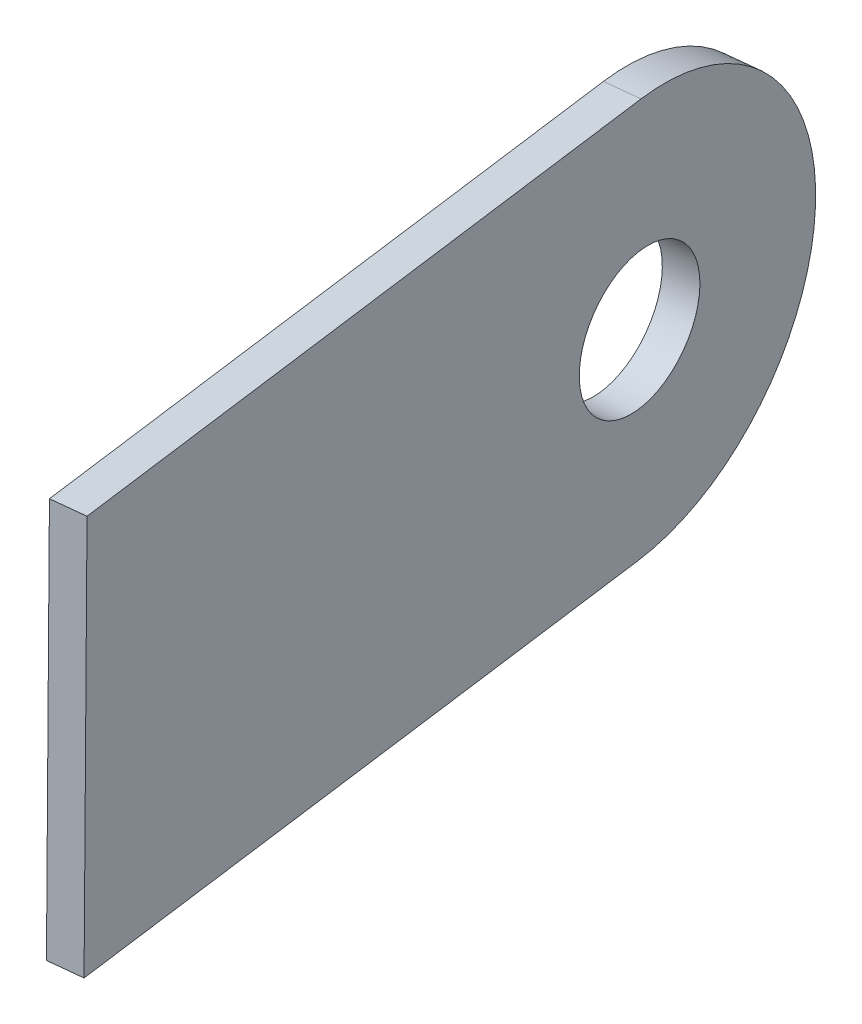
ISO-10303-21;
HEADER;
FILE_DESCRIPTION(('STEP AP214'),'2;1');
FILE_NAME('part.step','',(''),(''),'','','');
FILE_SCHEMA(('AUTOMOTIVE_DESIGN { 1 0 10303 214 1 1 1 1 }'));
ENDSEC;
DATA;
#1=APPLICATION_CONTEXT('core data for automotive mechanical design processes');
#2=APPLICATION_PROTOCOL_DEFINITION('international standard','automotive_design',2000,#1);
#3=PRODUCT_CONTEXT('',#1,'mechanical');
#4=PRODUCT('Part','Part','',(#3));
#5=PRODUCT_RELATED_PRODUCT_CATEGORY('part','',(#4));
#6=PRODUCT_DEFINITION_FORMATION('','',#4);
#7=PRODUCT_DEFINITION_CONTEXT('part definition',#1,'design');
#8=PRODUCT_DEFINITION('design','',#6,#7);
#9=PRODUCT_DEFINITION_SHAPE('','',#8);
#10=(LENGTH_UNIT() NAMED_UNIT(*) SI_UNIT(.MILLI.,.METRE.));
#11=(NAMED_UNIT(*) PLANE_ANGLE_UNIT() SI_UNIT($,.RADIAN.));
#12=(NAMED_UNIT(*) SI_UNIT($,.STERADIAN.) SOLID_ANGLE_UNIT());
#13=UNCERTAINTY_MEASURE_WITH_UNIT(LENGTH_MEASURE(1.E-05),#10,'distance_accuracy_value','');
#14=(GEOMETRIC_REPRESENTATION_CONTEXT(3) GLOBAL_UNCERTAINTY_ASSIGNED_CONTEXT((#13)) GLOBAL_UNIT_ASSIGNED_CONTEXT((#10,
#11,#12)) REPRESENTATION_CONTEXT('',''));
#15=CARTESIAN_POINT('',(0.,0.,0.));
#16=DIRECTION('',(0.,0.,1.));
#17=DIRECTION('',(1.,0.,0.));
#18=AXIS2_PLACEMENT_3D('',#15,#16,#17);
#19=CARTESIAN_POINT('',(310.062541986796,135.096645992842,-551.594597532469));
#20=DIRECTION('',(-0.992348265819815,0.0144812145690195,0.122618162394535));
#21=DIRECTION('',(0.122631021273154,0.,0.992452332669687));
#22=AXIS2_PLACEMENT_3D('',#19,#20,#21);
#23=PLANE('',#22);
#24=DIRECTION('',(-0.0156095263850589,-0.999844159646676,-0.00824615707260503));
#25=VECTOR('',#24,1.);
#26=CARTESIAN_POINT('',(313.584820993087,125.270500956842,-521.928340044654));
#27=LINE('',#26,#25);
#28=CARTESIAN_POINT('',(313.882182470723,144.317532198112,-521.771250752421));
#29=VERTEX_POINT('',#28);
#30=CARTESIAN_POINT('',(313.584820993087,125.270500956842,-521.928340044654));
#31=VERTEX_POINT('',#30);
#32=EDGE_CURVE('E91',#29,#31,#27,.T.);
#33=ORIENTED_EDGE('',*,*,#32,.T.);
#34=DIRECTION('',(-0.122479639166846,0.0100970711118635,-0.992419662816352));
#35=VECTOR('',#34,1.);
#36=CARTESIAN_POINT('',(309.913861247979,125.573130372207,-551.673142178586));
#37=LINE('',#36,#35);
#38=CARTESIAN_POINT('',(309.913861247979,125.573130372207,-551.673142178586));
#39=VERTEX_POINT('',#38);
#40=EDGE_CURVE('E86',#31,#39,#37,.T.);
#41=ORIENTED_EDGE('',*,*,#40,.T.);
#42=CARTESIAN_POINT('',(310.062541986796,135.096645992842,-551.594597532469));
#43=DIRECTION('',(0.992348265819815,-0.0144812145690195,-0.122618162394535));
#44=DIRECTION('',(0.122631021273154,0.,0.992452332669687));
#45=AXIS2_PLACEMENT_3D('',#42,#43,#44);
#46=CIRCLE('',#45,9.52500000000001);
#47=CARTESIAN_POINT('',(310.211222725614,144.620161613476,-551.516052886353));
#48=VERTEX_POINT('',#47);
#49=EDGE_CURVE('E89',#39,#48,#46,.T.);
#50=ORIENTED_EDGE('',*,*,#49,.T.);
#51=DIRECTION('',(0.122479639166846,-0.0100970711118644,0.992419662816352));
#52=VECTOR('',#51,1.);
#53=CARTESIAN_POINT('',(313.882182470723,144.317532198112,-521.771250752421));
#54=LINE('',#53,#52);
#55=EDGE_CURVE('E56',#48,#29,#54,.T.);
#56=ORIENTED_EDGE('',*,*,#55,.T.);
#57=EDGE_LOOP('',(#33,#41,#50,#56));
#58=FACE_BOUND('',#57,.T.);
#59=CARTESIAN_POINT('',(310.062541986796,135.096645992842,-551.594597532469));
#60=DIRECTION('',(0.992348265819815,-0.0144812145690195,-0.122618162394535));
#61=DIRECTION('',(-0.122631021273154,0.,-0.992452332669687));
#62=AXIS2_PLACEMENT_3D('',#59,#60,#61);
#63=CIRCLE('',#62,3.2639);
#64=CARTESIAN_POINT('',(309.662286596463,135.096645992842,-554.83386270107));
#65=VERTEX_POINT('',#64);
#66=EDGE_CURVE('E106',#65,#65,#63,.T.);
#67=ORIENTED_EDGE('',*,*,#66,.F.);
#68=EDGE_LOOP('',(#67));
#69=FACE_BOUND('',#68,.T.);
#70=ADVANCED_FACE('F39',(#58,#69),#23,.F.);
#71=CARTESIAN_POINT('',(308.487189114808,135.11963492097,-551.399941199668));
#72=DIRECTION('',(-0.992348265819815,0.0144812145690195,0.122618162394535));
#73=DIRECTION('',(0.122631021273154,0.,0.992452332669687));
#74=AXIS2_PLACEMENT_3D('',#71,#72,#73);
#75=PLANE('',#74);
#76=DIRECTION('',(-0.0156095263850589,-0.999844159646676,-0.00824615707260503));
#77=VECTOR('',#76,1.);
#78=CARTESIAN_POINT('',(312.009468121099,125.293489884971,-521.733683711853));
#79=LINE('',#78,#77);
#80=CARTESIAN_POINT('',(312.306829598734,144.34052112624,-521.57659441962));
#81=VERTEX_POINT('',#80);
#82=CARTESIAN_POINT('',(312.009468121099,125.293489884971,-521.733683711853));
#83=VERTEX_POINT('',#82);
#84=EDGE_CURVE('E103',#81,#83,#79,.T.);
#85=ORIENTED_EDGE('',*,*,#84,.F.);
#86=DIRECTION('',(0.122479639166846,-0.0100970711118644,0.992419662816352));
#87=VECTOR('',#86,1.);
#88=CARTESIAN_POINT('',(312.306829598734,144.34052112624,-521.57659441962));
#89=LINE('',#88,#87);
#90=CARTESIAN_POINT('',(308.635869853625,144.643150541605,-551.321396553551));
#91=VERTEX_POINT('',#90);
#92=EDGE_CURVE('E79',#91,#81,#89,.T.);
#93=ORIENTED_EDGE('',*,*,#92,.F.);
#94=CARTESIAN_POINT('',(308.487189114808,135.11963492097,-551.399941199668));
#95=DIRECTION('',(0.992348265819815,-0.0144812145690195,-0.122618162394535));
#96=DIRECTION('',(0.122631021273154,0.,0.992452332669687));
#97=AXIS2_PLACEMENT_3D('',#94,#95,#96);
#98=CIRCLE('',#97,9.52500000000001);
#99=CARTESIAN_POINT('',(308.33850837599,125.596119300336,-551.478485845784));
#100=VERTEX_POINT('',#99);
#101=EDGE_CURVE('E73',#100,#91,#98,.T.);
#102=ORIENTED_EDGE('',*,*,#101,.F.);
#103=DIRECTION('',(-0.122479639166846,0.0100970711118635,-0.992419662816352));
#104=VECTOR('',#103,1.);
#105=CARTESIAN_POINT('',(308.33850837599,125.596119300336,-551.478485845784));
#106=LINE('',#105,#104);
#107=EDGE_CURVE('E95',#83,#100,#106,.T.);
#108=ORIENTED_EDGE('',*,*,#107,.F.);
#109=EDGE_LOOP('',(#85,#93,#102,#108));
#110=FACE_BOUND('',#109,.T.);
#111=CARTESIAN_POINT('',(308.487189114808,135.11963492097,-551.399941199668));
#112=DIRECTION('',(0.992348265819815,-0.0144812145690195,-0.122618162394535));
#113=DIRECTION('',(-0.122631021273154,0.,-0.992452332669687));
#114=AXIS2_PLACEMENT_3D('',#111,#112,#113);
#115=CIRCLE('',#114,3.2639);
#116=CARTESIAN_POINT('',(308.086933724474,135.11963492097,-554.639206368268));
#117=VERTEX_POINT('',#116);
#118=EDGE_CURVE('E118',#117,#117,#115,.T.);
#119=ORIENTED_EDGE('',*,*,#118,.T.);
#120=EDGE_LOOP('',(#119));
#121=FACE_BOUND('',#120,.T.);
#122=ADVANCED_FACE('F114',(#110,#121),#75,.T.);
#123=CARTESIAN_POINT('',(313.584820993087,125.270500956842,-521.928340044654));
#124=DIRECTION('',(-0.122479639166846,0.0100970711118623,-0.992419662816352));
#125=DIRECTION('',(-0.992470255696503,0.,0.122485883095637));
#126=AXIS2_PLACEMENT_3D('',#123,#124,#125);
#127=PLANE('',#126);
#128=ORIENTED_EDGE('',*,*,#84,.T.);
#129=DIRECTION('',(-0.992348265819815,0.0144812145690195,0.122618162394535));
#130=VECTOR('',#129,1.);
#131=CARTESIAN_POINT('',(313.584820993087,125.270500956842,-521.928340044654));
#132=LINE('',#131,#130);
#133=EDGE_CURVE('E11',#31,#83,#132,.T.);
#134=ORIENTED_EDGE('',*,*,#133,.F.);
#135=ORIENTED_EDGE('',*,*,#32,.F.);
#136=DIRECTION('',(-0.992348265819815,0.0144812145690195,0.122618162394535));
#137=VECTOR('',#136,1.);
#138=CARTESIAN_POINT('',(313.882182470723,144.317532198112,-521.771250752421));
#139=LINE('',#138,#137);
#140=EDGE_CURVE('E99',#29,#81,#139,.T.);
#141=ORIENTED_EDGE('',*,*,#140,.T.);
#142=EDGE_LOOP('',(#128,#134,#135,#141));
#143=FACE_BOUND('',#142,.T.);
#144=ADVANCED_FACE('F41',(#143),#127,.F.);
#145=CARTESIAN_POINT('',(309.913861247979,125.573130372207,-551.673142178586));
#146=DIRECTION('',(0.0156095263850613,0.999844159646676,0.00824615707260589));
#147=DIRECTION('',(-0.999878155635189,0.0156100571290523,0.));
#148=AXIS2_PLACEMENT_3D('',#145,#146,#147);
#149=PLANE('',#148);
#150=ORIENTED_EDGE('',*,*,#107,.T.);
#151=DIRECTION('',(-0.992348265819815,0.0144812145690195,0.122618162394535));
#152=VECTOR('',#151,1.);
#153=CARTESIAN_POINT('',(309.913861247979,125.573130372207,-551.673142178586));
#154=LINE('',#153,#152);
#155=EDGE_CURVE('E48',#39,#100,#154,.T.);
#156=ORIENTED_EDGE('',*,*,#155,.F.);
#157=ORIENTED_EDGE('',*,*,#40,.F.);
#158=ORIENTED_EDGE('',*,*,#133,.T.);
#159=EDGE_LOOP('',(#150,#156,#157,#158));
#160=FACE_BOUND('',#159,.T.);
#161=ADVANCED_FACE('F94',(#160),#149,.F.);
#162=CARTESIAN_POINT('',(310.062541986796,135.096645992842,-551.594597532469));
#163=DIRECTION('',(-0.992348265819815,0.0144812145690195,0.122618162394535));
#164=DIRECTION('',(0.122631021273154,0.,0.992452332669687));
#165=AXIS2_PLACEMENT_3D('',#162,#163,#164);
#166=CYLINDRICAL_SURFACE('',#165,9.52500000000001);
#167=ORIENTED_EDGE('',*,*,#101,.T.);
#168=DIRECTION('',(-0.992348265819815,0.0144812145690195,0.122618162394535));
#169=VECTOR('',#168,1.);
#170=CARTESIAN_POINT('',(310.211222725614,144.620161613476,-551.516052886353));
#171=LINE('',#170,#169);
#172=EDGE_CURVE('E96',#48,#91,#171,.T.);
#173=ORIENTED_EDGE('',*,*,#172,.F.);
#174=ORIENTED_EDGE('',*,*,#49,.F.);
#175=ORIENTED_EDGE('',*,*,#155,.T.);
#176=EDGE_LOOP('',(#167,#173,#174,#175));
#177=FACE_BOUND('',#176,.T.);
#178=ADVANCED_FACE('F97',(#177),#166,.T.);
#179=CARTESIAN_POINT('',(313.882182470723,144.317532198112,-521.771250752421));
#180=DIRECTION('',(-0.0156095263850614,-0.999844159646676,-0.00824615707260681));
#181=DIRECTION('',(0.999878155635189,-0.0156100571290524,0.));
#182=AXIS2_PLACEMENT_3D('',#179,#180,#181);
#183=PLANE('',#182);
#184=ORIENTED_EDGE('',*,*,#92,.T.);
#185=ORIENTED_EDGE('',*,*,#140,.F.);
#186=ORIENTED_EDGE('',*,*,#55,.F.);
#187=ORIENTED_EDGE('',*,*,#172,.T.);
#188=EDGE_LOOP('',(#184,#185,#186,#187));
#189=FACE_BOUND('',#188,.T.);
#190=ADVANCED_FACE('F111',(#189),#183,.F.);
#191=CARTESIAN_POINT('',(310.062541986796,135.096645992842,-551.594597532469));
#192=DIRECTION('',(-0.992348265819815,0.0144812145690195,0.122618162394535));
#193=DIRECTION('',(0.122631021273154,0.,0.992452332669687));
#194=AXIS2_PLACEMENT_3D('',#191,#192,#193);
#195=CYLINDRICAL_SURFACE('',#194,3.2639);
#196=ORIENTED_EDGE('',*,*,#66,.T.);
#197=EDGE_LOOP('',(#196));
#198=FACE_BOUND('',#197,.T.);
#199=ORIENTED_EDGE('',*,*,#118,.F.);
#200=EDGE_LOOP('',(#199));
#201=FACE_BOUND('',#200,.T.);
#202=ADVANCED_FACE('F124',(#198,#201),#195,.F.);
#203=CLOSED_SHELL('',(#70,#122,#144,#161,#178,#190,#202));
#204=MANIFOLD_SOLID_BREP('B2',#203);
#205=ADVANCED_BREP_SHAPE_REPRESENTATION('',(#18,#204),#14);
#206=SHAPE_DEFINITION_REPRESENTATION(#9,#205);
ENDSEC;
END-ISO-10303-21;
